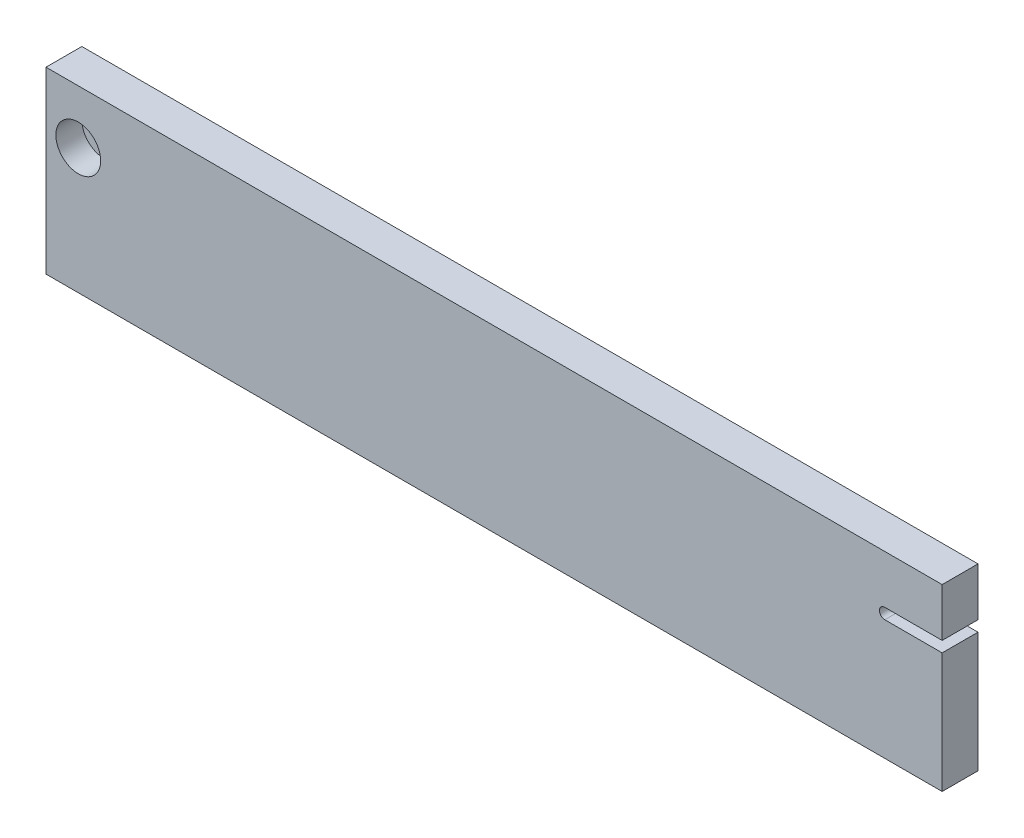
ISO-10303-21;
HEADER;
FILE_DESCRIPTION(('STEP AP214'),'2;1');
FILE_NAME('part.step','',(''),(''),'','','');
FILE_SCHEMA(('AUTOMOTIVE_DESIGN { 1 0 10303 214 1 1 1 1 }'));
ENDSEC;
DATA;
#1=APPLICATION_CONTEXT('core data for automotive mechanical design processes');
#2=APPLICATION_PROTOCOL_DEFINITION('international standard','automotive_design',2000,#1);
#3=PRODUCT_CONTEXT('',#1,'mechanical');
#4=PRODUCT('Part','Part','',(#3));
#5=PRODUCT_RELATED_PRODUCT_CATEGORY('part','',(#4));
#6=PRODUCT_DEFINITION_FORMATION('','',#4);
#7=PRODUCT_DEFINITION_CONTEXT('part definition',#1,'design');
#8=PRODUCT_DEFINITION('design','',#6,#7);
#9=PRODUCT_DEFINITION_SHAPE('','',#8);
#10=(LENGTH_UNIT() NAMED_UNIT(*) SI_UNIT(.MILLI.,.METRE.));
#11=(NAMED_UNIT(*) PLANE_ANGLE_UNIT() SI_UNIT($,.RADIAN.));
#12=(NAMED_UNIT(*) SI_UNIT($,.STERADIAN.) SOLID_ANGLE_UNIT());
#13=UNCERTAINTY_MEASURE_WITH_UNIT(LENGTH_MEASURE(1.E-05),#10,'distance_accuracy_value','');
#14=(GEOMETRIC_REPRESENTATION_CONTEXT(3) GLOBAL_UNCERTAINTY_ASSIGNED_CONTEXT((#13)) GLOBAL_UNIT_ASSIGNED_CONTEXT((#10,
#11,#12)) REPRESENTATION_CONTEXT('',''));
#15=CARTESIAN_POINT('',(0.,0.,0.));
#16=DIRECTION('',(0.,0.,1.));
#17=DIRECTION('',(1.,0.,0.));
#18=AXIS2_PLACEMENT_3D('',#15,#16,#17);
#19=CARTESIAN_POINT('',(18.,70.,0.));
#20=DIRECTION('',(0.,0.,1.));
#21=DIRECTION('',(1.,0.,0.));
#22=AXIS2_PLACEMENT_3D('',#19,#20,#21);
#23=CYLINDRICAL_SURFACE('',#22,3.);
#24=CARTESIAN_POINT('',(18.,70.,0.));
#25=DIRECTION('',(0.,0.,1.));
#26=DIRECTION('',(1.,0.,0.));
#27=AXIS2_PLACEMENT_3D('',#24,#25,#26);
#28=CIRCLE('',#27,3.);
#29=CARTESIAN_POINT('',(21.,70.,0.));
#30=VERTEX_POINT('',#29);
#31=EDGE_CURVE('E148',#30,#30,#28,.T.);
#32=ORIENTED_EDGE('',*,*,#31,.F.);
#33=EDGE_LOOP('',(#32));
#34=FACE_BOUND('',#33,.T.);
#35=CARTESIAN_POINT('',(18.,70.,2.9));
#36=DIRECTION('',(0.,0.,1.));
#37=DIRECTION('',(1.,0.,0.));
#38=AXIS2_PLACEMENT_3D('',#35,#36,#37);
#39=CIRCLE('',#38,3.);
#40=CARTESIAN_POINT('',(21.,70.,2.9));
#41=VERTEX_POINT('',#40);
#42=EDGE_CURVE('E47',#41,#41,#39,.F.);
#43=ORIENTED_EDGE('',*,*,#42,.F.);
#44=EDGE_LOOP('',(#43));
#45=FACE_BOUND('',#44,.T.);
#46=ADVANCED_FACE('F43',(#34,#45),#23,.F.);
#47=CARTESIAN_POINT('',(500.,0.,20.));
#48=DIRECTION('',(-1.,0.,0.));
#49=DIRECTION('',(0.,0.,1.));
#50=AXIS2_PLACEMENT_3D('',#47,#48,#49);
#51=PLANE('',#50);
#52=DIRECTION('',(0.,1.,0.));
#53=VECTOR('',#52,1.);
#54=CARTESIAN_POINT('',(500.,0.,20.));
#55=LINE('',#54,#53);
#56=CARTESIAN_POINT('',(500.,73.,20.));
#57=VERTEX_POINT('',#56);
#58=CARTESIAN_POINT('',(500.,100.,20.));
#59=VERTEX_POINT('',#58);
#60=EDGE_CURVE('E162',#57,#59,#55,.T.);
#61=ORIENTED_EDGE('',*,*,#60,.F.);
#62=DIRECTION('',(0.,0.,-1.));
#63=VECTOR('',#62,1.);
#64=CARTESIAN_POINT('',(500.,73.,20.));
#65=LINE('',#64,#63);
#66=CARTESIAN_POINT('',(500.,73.,0.));
#67=VERTEX_POINT('',#66);
#68=EDGE_CURVE('E155',#57,#67,#65,.T.);
#69=ORIENTED_EDGE('',*,*,#68,.T.);
#70=DIRECTION('',(0.,1.,0.));
#71=VECTOR('',#70,1.);
#72=CARTESIAN_POINT('',(500.,0.,0.));
#73=LINE('',#72,#71);
#74=CARTESIAN_POINT('',(500.,100.,0.));
#75=VERTEX_POINT('',#74);
#76=EDGE_CURVE('E172',#67,#75,#73,.T.);
#77=ORIENTED_EDGE('',*,*,#76,.T.);
#78=DIRECTION('',(0.,0.,-1.));
#79=VECTOR('',#78,1.);
#80=CARTESIAN_POINT('',(500.,100.,20.));
#81=LINE('',#80,#79);
#82=EDGE_CURVE('E177',#59,#75,#81,.T.);
#83=ORIENTED_EDGE('',*,*,#82,.F.);
#84=EDGE_LOOP('',(#61,#69,#77,#83));
#85=FACE_BOUND('',#84,.T.);
#86=ADVANCED_FACE('F196',(#85),#51,.F.);
#87=CARTESIAN_POINT('',(0.,0.,20.));
#88=DIRECTION('',(1.,0.,0.));
#89=DIRECTION('',(0.,0.,-1.));
#90=AXIS2_PLACEMENT_3D('',#87,#88,#89);
#91=PLANE('',#90);
#92=DIRECTION('',(0.,-1.,0.));
#93=VECTOR('',#92,1.);
#94=CARTESIAN_POINT('',(0.,0.,0.));
#95=LINE('',#94,#93);
#96=CARTESIAN_POINT('',(0.,100.,0.));
#97=VERTEX_POINT('',#96);
#98=CARTESIAN_POINT('',(0.,0.,0.));
#99=VERTEX_POINT('',#98);
#100=EDGE_CURVE('E158',#97,#99,#95,.T.);
#101=ORIENTED_EDGE('',*,*,#100,.T.);
#102=DIRECTION('',(0.,0.,-1.));
#103=VECTOR('',#102,1.);
#104=CARTESIAN_POINT('',(0.,0.,20.));
#105=LINE('',#104,#103);
#106=CARTESIAN_POINT('',(0.,0.,20.));
#107=VERTEX_POINT('',#106);
#108=EDGE_CURVE('E52',#107,#99,#105,.T.);
#109=ORIENTED_EDGE('',*,*,#108,.F.);
#110=DIRECTION('',(0.,-1.,0.));
#111=VECTOR('',#110,1.);
#112=CARTESIAN_POINT('',(0.,0.,20.));
#113=LINE('',#112,#111);
#114=CARTESIAN_POINT('',(0.,100.,20.));
#115=VERTEX_POINT('',#114);
#116=EDGE_CURVE('E159',#115,#107,#113,.T.);
#117=ORIENTED_EDGE('',*,*,#116,.F.);
#118=DIRECTION('',(0.,0.,-1.));
#119=VECTOR('',#118,1.);
#120=CARTESIAN_POINT('',(0.,100.,20.));
#121=LINE('',#120,#119);
#122=EDGE_CURVE('E167',#115,#97,#121,.T.);
#123=ORIENTED_EDGE('',*,*,#122,.T.);
#124=EDGE_LOOP('',(#101,#109,#117,#123));
#125=FACE_BOUND('',#124,.T.);
#126=ADVANCED_FACE('F45',(#125),#91,.F.);
#127=CARTESIAN_POINT('',(0.,0.,20.));
#128=DIRECTION('',(0.,1.,0.));
#129=DIRECTION('',(0.,0.,1.));
#130=AXIS2_PLACEMENT_3D('',#127,#128,#129);
#131=PLANE('',#130);
#132=DIRECTION('',(1.,0.,0.));
#133=VECTOR('',#132,1.);
#134=CARTESIAN_POINT('',(0.,0.,0.));
#135=LINE('',#134,#133);
#136=CARTESIAN_POINT('',(500.,0.,0.));
#137=VERTEX_POINT('',#136);
#138=EDGE_CURVE('E170',#99,#137,#135,.T.);
#139=ORIENTED_EDGE('',*,*,#138,.T.);
#140=DIRECTION('',(0.,0.,-1.));
#141=VECTOR('',#140,1.);
#142=CARTESIAN_POINT('',(500.,0.,20.));
#143=LINE('',#142,#141);
#144=CARTESIAN_POINT('',(500.,0.,20.));
#145=VERTEX_POINT('',#144);
#146=EDGE_CURVE('E179',#145,#137,#143,.T.);
#147=ORIENTED_EDGE('',*,*,#146,.F.);
#148=DIRECTION('',(1.,0.,0.));
#149=VECTOR('',#148,1.);
#150=CARTESIAN_POINT('',(0.,0.,20.));
#151=LINE('',#150,#149);
#152=EDGE_CURVE('E97',#107,#145,#151,.T.);
#153=ORIENTED_EDGE('',*,*,#152,.F.);
#154=ORIENTED_EDGE('',*,*,#108,.T.);
#155=EDGE_LOOP('',(#139,#147,#153,#154));
#156=FACE_BOUND('',#155,.T.);
#157=ADVANCED_FACE('F183',(#156),#131,.F.);
#158=CARTESIAN_POINT('',(500.,67.,0.));
#159=VERTEX_POINT('',#158);
#160=EDGE_CURVE('E173',#137,#159,#73,.T.);
#161=ORIENTED_EDGE('',*,*,#160,.T.);
#162=DIRECTION('',(0.,0.,1.));
#163=VECTOR('',#162,1.);
#164=CARTESIAN_POINT('',(500.,67.,20.));
#165=LINE('',#164,#163);
#166=CARTESIAN_POINT('',(500.,67.,20.));
#167=VERTEX_POINT('',#166);
#168=EDGE_CURVE('E59',#159,#167,#165,.T.);
#169=ORIENTED_EDGE('',*,*,#168,.T.);
#170=EDGE_CURVE('E163',#145,#167,#55,.T.);
#171=ORIENTED_EDGE('',*,*,#170,.F.);
#172=ORIENTED_EDGE('',*,*,#146,.T.);
#173=EDGE_LOOP('',(#161,#169,#171,#172));
#174=FACE_BOUND('',#173,.T.);
#175=ADVANCED_FACE('F188',(#174),#51,.F.);
#176=CARTESIAN_POINT('',(0.,100.,20.));
#177=DIRECTION('',(0.,-1.,0.));
#178=DIRECTION('',(0.,0.,-1.));
#179=AXIS2_PLACEMENT_3D('',#176,#177,#178);
#180=PLANE('',#179);
#181=DIRECTION('',(-1.,0.,0.));
#182=VECTOR('',#181,1.);
#183=CARTESIAN_POINT('',(0.,100.,0.));
#184=LINE('',#183,#182);
#185=EDGE_CURVE('E89',#75,#97,#184,.T.);
#186=ORIENTED_EDGE('',*,*,#185,.T.);
#187=ORIENTED_EDGE('',*,*,#122,.F.);
#188=DIRECTION('',(-1.,0.,0.));
#189=VECTOR('',#188,1.);
#190=CARTESIAN_POINT('',(0.,100.,20.));
#191=LINE('',#190,#189);
#192=EDGE_CURVE('E68',#59,#115,#191,.T.);
#193=ORIENTED_EDGE('',*,*,#192,.F.);
#194=ORIENTED_EDGE('',*,*,#82,.T.);
#195=EDGE_LOOP('',(#186,#187,#193,#194));
#196=FACE_BOUND('',#195,.T.);
#197=ADVANCED_FACE('F197',(#196),#180,.F.);
#198=CARTESIAN_POINT('',(0.,0.,20.));
#199=DIRECTION('',(0.,0.,-1.));
#200=DIRECTION('',(-1.,0.,0.));
#201=AXIS2_PLACEMENT_3D('',#198,#199,#200);
#202=PLANE('',#201);
#203=CARTESIAN_POINT('',(18.,70.,20.));
#204=DIRECTION('',(0.,0.,1.));
#205=DIRECTION('',(1.,0.,0.));
#206=AXIS2_PLACEMENT_3D('',#203,#204,#205);
#207=CIRCLE('',#206,12.5);
#208=CARTESIAN_POINT('',(30.5,70.,20.));
#209=VERTEX_POINT('',#208);
#210=EDGE_CURVE('E144',#209,#209,#207,.T.);
#211=ORIENTED_EDGE('',*,*,#210,.F.);
#212=EDGE_LOOP('',(#211));
#213=FACE_BOUND('',#212,.T.);
#214=CARTESIAN_POINT('',(468.,70.,20.));
#215=DIRECTION('',(0.,0.,1.));
#216=DIRECTION('',(1.,0.,0.));
#217=AXIS2_PLACEMENT_3D('',#214,#215,#216);
#218=CIRCLE('',#217,3.);
#219=CARTESIAN_POINT('',(468.,73.,20.));
#220=VERTEX_POINT('',#219);
#221=CARTESIAN_POINT('',(468.,67.,20.));
#222=VERTEX_POINT('',#221);
#223=EDGE_CURVE('E126',#220,#222,#218,.T.);
#224=ORIENTED_EDGE('',*,*,#223,.F.);
#225=DIRECTION('',(-1.,0.,0.));
#226=VECTOR('',#225,1.);
#227=CARTESIAN_POINT('',(468.,73.,20.));
#228=LINE('',#227,#226);
#229=EDGE_CURVE('E139',#57,#220,#228,.T.);
#230=ORIENTED_EDGE('',*,*,#229,.F.);
#231=ORIENTED_EDGE('',*,*,#60,.T.);
#232=ORIENTED_EDGE('',*,*,#192,.T.);
#233=ORIENTED_EDGE('',*,*,#116,.T.);
#234=ORIENTED_EDGE('',*,*,#152,.T.);
#235=ORIENTED_EDGE('',*,*,#170,.T.);
#236=DIRECTION('',(1.,0.,0.));
#237=VECTOR('',#236,1.);
#238=CARTESIAN_POINT('',(468.,67.,20.));
#239=LINE('',#238,#237);
#240=EDGE_CURVE('E141',#222,#167,#239,.T.);
#241=ORIENTED_EDGE('',*,*,#240,.F.);
#242=EDGE_LOOP('',(#224,#230,#231,#232,#233,#234,#235,#241));
#243=FACE_BOUND('',#242,.T.);
#244=ADVANCED_FACE('F190',(#213,#243),#202,.F.);
#245=CARTESIAN_POINT('',(0.,0.,0.));
#246=DIRECTION('',(0.,0.,-1.));
#247=DIRECTION('',(-1.,0.,0.));
#248=AXIS2_PLACEMENT_3D('',#245,#246,#247);
#249=PLANE('',#248);
#250=CARTESIAN_POINT('',(18.,61.5,0.));
#251=DIRECTION('',(0.,0.,1.));
#252=DIRECTION('',(1.,0.,0.));
#253=AXIS2_PLACEMENT_3D('',#250,#251,#252);
#254=CIRCLE('',#253,1.5);
#255=CARTESIAN_POINT('',(19.5,61.5,0.));
#256=VERTEX_POINT('',#255);
#257=EDGE_CURVE('E230',#256,#256,#254,.T.);
#258=ORIENTED_EDGE('',*,*,#257,.T.);
#259=EDGE_LOOP('',(#258));
#260=FACE_BOUND('',#259,.T.);
#261=CARTESIAN_POINT('',(18.,78.5,0.));
#262=DIRECTION('',(0.,0.,1.));
#263=DIRECTION('',(1.,0.,0.));
#264=AXIS2_PLACEMENT_3D('',#261,#262,#263);
#265=CIRCLE('',#264,1.5);
#266=CARTESIAN_POINT('',(19.5,78.5,0.));
#267=VERTEX_POINT('',#266);
#268=EDGE_CURVE('E233',#267,#267,#265,.T.);
#269=ORIENTED_EDGE('',*,*,#268,.T.);
#270=EDGE_LOOP('',(#269));
#271=FACE_BOUND('',#270,.T.);
#272=DIRECTION('',(1.,0.,0.));
#273=VECTOR('',#272,1.);
#274=CARTESIAN_POINT('',(0.,73.,0.));
#275=LINE('',#274,#273);
#276=CARTESIAN_POINT('',(468.,73.,0.));
#277=VERTEX_POINT('',#276);
#278=EDGE_CURVE('E11',#277,#67,#275,.T.);
#279=ORIENTED_EDGE('',*,*,#278,.F.);
#280=CARTESIAN_POINT('',(468.,70.,0.));
#281=DIRECTION('',(0.,0.,1.));
#282=DIRECTION('',(1.,0.,0.));
#283=AXIS2_PLACEMENT_3D('',#280,#281,#282);
#284=CIRCLE('',#283,3.);
#285=CARTESIAN_POINT('',(468.,67.,0.));
#286=VERTEX_POINT('',#285);
#287=EDGE_CURVE('E123',#277,#286,#284,.T.);
#288=ORIENTED_EDGE('',*,*,#287,.T.);
#289=DIRECTION('',(1.,0.,0.));
#290=VECTOR('',#289,1.);
#291=CARTESIAN_POINT('',(468.,67.,0.));
#292=LINE('',#291,#290);
#293=EDGE_CURVE('E129',#286,#159,#292,.T.);
#294=ORIENTED_EDGE('',*,*,#293,.T.);
#295=ORIENTED_EDGE('',*,*,#160,.F.);
#296=ORIENTED_EDGE('',*,*,#138,.F.);
#297=ORIENTED_EDGE('',*,*,#100,.F.);
#298=ORIENTED_EDGE('',*,*,#185,.F.);
#299=ORIENTED_EDGE('',*,*,#76,.F.);
#300=EDGE_LOOP('',(#279,#288,#294,#295,#296,#297,#298,#299));
#301=FACE_BOUND('',#300,.T.);
#302=ORIENTED_EDGE('',*,*,#31,.T.);
#303=EDGE_LOOP('',(#302));
#304=FACE_BOUND('',#303,.T.);
#305=ADVANCED_FACE('F136',(#260,#271,#301,#304),#249,.T.);
#306=CARTESIAN_POINT('',(468.,73.,0.));
#307=DIRECTION('',(0.,1.,0.));
#308=DIRECTION('',(0.,0.,1.));
#309=AXIS2_PLACEMENT_3D('',#306,#307,#308);
#310=PLANE('',#309);
#311=ORIENTED_EDGE('',*,*,#229,.T.);
#312=DIRECTION('',(0.,0.,1.));
#313=VECTOR('',#312,1.);
#314=CARTESIAN_POINT('',(468.,73.,0.));
#315=LINE('',#314,#313);
#316=EDGE_CURVE('E128',#277,#220,#315,.T.);
#317=ORIENTED_EDGE('',*,*,#316,.F.);
#318=ORIENTED_EDGE('',*,*,#278,.T.);
#319=ORIENTED_EDGE('',*,*,#68,.F.);
#320=EDGE_LOOP('',(#311,#317,#318,#319));
#321=FACE_BOUND('',#320,.T.);
#322=ADVANCED_FACE('F221',(#321),#310,.F.);
#323=CARTESIAN_POINT('',(468.,67.,0.));
#324=DIRECTION('',(0.,-1.,0.));
#325=DIRECTION('',(0.,0.,-1.));
#326=AXIS2_PLACEMENT_3D('',#323,#324,#325);
#327=PLANE('',#326);
#328=ORIENTED_EDGE('',*,*,#293,.F.);
#329=DIRECTION('',(0.,0.,1.));
#330=VECTOR('',#329,1.);
#331=CARTESIAN_POINT('',(468.,67.,0.));
#332=LINE('',#331,#330);
#333=EDGE_CURVE('E119',#286,#222,#332,.T.);
#334=ORIENTED_EDGE('',*,*,#333,.T.);
#335=ORIENTED_EDGE('',*,*,#240,.T.);
#336=ORIENTED_EDGE('',*,*,#168,.F.);
#337=EDGE_LOOP('',(#328,#334,#335,#336));
#338=FACE_BOUND('',#337,.T.);
#339=ADVANCED_FACE('F131',(#338),#327,.F.);
#340=CARTESIAN_POINT('',(468.,70.,0.));
#341=DIRECTION('',(0.,0.,1.));
#342=DIRECTION('',(1.,0.,0.));
#343=AXIS2_PLACEMENT_3D('',#340,#341,#342);
#344=CYLINDRICAL_SURFACE('',#343,3.);
#345=ORIENTED_EDGE('',*,*,#223,.T.);
#346=ORIENTED_EDGE('',*,*,#333,.F.);
#347=ORIENTED_EDGE('',*,*,#287,.F.);
#348=ORIENTED_EDGE('',*,*,#316,.T.);
#349=EDGE_LOOP('',(#345,#346,#347,#348));
#350=FACE_BOUND('',#349,.T.);
#351=ADVANCED_FACE('F120',(#350),#344,.F.);
#352=CARTESIAN_POINT('',(18.,70.,5.5));
#353=DIRECTION('',(0.,0.,1.));
#354=DIRECTION('',(1.,0.,0.));
#355=AXIS2_PLACEMENT_3D('',#352,#353,#354);
#356=PLANE('',#355);
#357=CARTESIAN_POINT('',(18.,61.5,5.5));
#358=DIRECTION('',(0.,0.,1.));
#359=DIRECTION('',(1.,0.,0.));
#360=AXIS2_PLACEMENT_3D('',#357,#358,#359);
#361=CIRCLE('',#360,1.5);
#362=CARTESIAN_POINT('',(19.5,61.5,5.5));
#363=VERTEX_POINT('',#362);
#364=EDGE_CURVE('E235',#363,#363,#361,.T.);
#365=ORIENTED_EDGE('',*,*,#364,.F.);
#366=EDGE_LOOP('',(#365));
#367=FACE_BOUND('',#366,.T.);
#368=CARTESIAN_POINT('',(18.,78.5,5.5));
#369=DIRECTION('',(0.,0.,1.));
#370=DIRECTION('',(1.,0.,0.));
#371=AXIS2_PLACEMENT_3D('',#368,#369,#370);
#372=CIRCLE('',#371,1.5);
#373=CARTESIAN_POINT('',(19.5,78.5,5.5));
#374=VERTEX_POINT('',#373);
#375=EDGE_CURVE('E236',#374,#374,#372,.T.);
#376=ORIENTED_EDGE('',*,*,#375,.F.);
#377=EDGE_LOOP('',(#376));
#378=FACE_BOUND('',#377,.T.);
#379=CARTESIAN_POINT('',(18.,70.,5.5));
#380=DIRECTION('',(0.,0.,1.));
#381=DIRECTION('',(1.,0.,0.));
#382=AXIS2_PLACEMENT_3D('',#379,#380,#381);
#383=CIRCLE('',#382,3.5);
#384=CARTESIAN_POINT('',(21.5,70.,5.5));
#385=VERTEX_POINT('',#384);
#386=EDGE_CURVE('E247',#385,#385,#383,.T.);
#387=ORIENTED_EDGE('',*,*,#386,.F.);
#388=EDGE_LOOP('',(#387));
#389=FACE_BOUND('',#388,.T.);
#390=CARTESIAN_POINT('',(18.,70.,5.5));
#391=DIRECTION('',(0.,0.,1.));
#392=DIRECTION('',(1.,0.,0.));
#393=AXIS2_PLACEMENT_3D('',#390,#391,#392);
#394=CIRCLE('',#393,12.5);
#395=CARTESIAN_POINT('',(30.5,70.,5.5));
#396=VERTEX_POINT('',#395);
#397=EDGE_CURVE('E153',#396,#396,#394,.T.);
#398=ORIENTED_EDGE('',*,*,#397,.T.);
#399=EDGE_LOOP('',(#398));
#400=FACE_BOUND('',#399,.T.);
#401=ADVANCED_FACE('F269',(#367,#378,#389,#400),#356,.T.);
#402=CARTESIAN_POINT('',(18.,70.,5.5));
#403=DIRECTION('',(0.,0.,1.));
#404=DIRECTION('',(1.,0.,0.));
#405=AXIS2_PLACEMENT_3D('',#402,#403,#404);
#406=CYLINDRICAL_SURFACE('',#405,12.5);
#407=CARTESIAN_POINT('',(30.5,70.,5.5));
#408=CARTESIAN_POINT('',(30.5,70.,5.65104166666667));
#409=CARTESIAN_POINT('',(30.5,70.,5.80208333333333));
#410=CARTESIAN_POINT('',(30.5,70.,6.10416666666667));
#411=CARTESIAN_POINT('',(30.5,70.,6.25520833333333));
#412=CARTESIAN_POINT('',(30.5,70.,6.55729166666667));
#413=CARTESIAN_POINT('',(30.5,70.,6.70833333333333));
#414=CARTESIAN_POINT('',(30.5,70.,7.01041666666667));
#415=CARTESIAN_POINT('',(30.5,70.,7.16145833333333));
#416=CARTESIAN_POINT('',(30.5,70.,7.46354166666667));
#417=CARTESIAN_POINT('',(30.5,70.,7.61458333333333));
#418=CARTESIAN_POINT('',(30.5,70.,7.91666666666667));
#419=CARTESIAN_POINT('',(30.5,70.,8.06770833333333));
#420=CARTESIAN_POINT('',(30.5,70.,8.36979166666667));
#421=CARTESIAN_POINT('',(30.5,70.,8.52083333333333));
#422=CARTESIAN_POINT('',(30.5,70.,8.82291666666667));
#423=CARTESIAN_POINT('',(30.5,70.,8.97395833333333));
#424=CARTESIAN_POINT('',(30.5,70.,9.27604166666667));
#425=CARTESIAN_POINT('',(30.5,70.,9.42708333333333));
#426=CARTESIAN_POINT('',(30.5,70.,9.72916666666667));
#427=CARTESIAN_POINT('',(30.5,70.,9.88020833333333));
#428=CARTESIAN_POINT('',(30.5,70.,10.1822916666667));
#429=CARTESIAN_POINT('',(30.5,70.,10.3333333333333));
#430=CARTESIAN_POINT('',(30.5,70.,10.6354166666667));
#431=CARTESIAN_POINT('',(30.5,70.,10.7864583333333));
#432=CARTESIAN_POINT('',(30.5,70.,11.0885416666667));
#433=CARTESIAN_POINT('',(30.5,70.,11.2395833333333));
#434=CARTESIAN_POINT('',(30.5,70.,11.5416666666667));
#435=CARTESIAN_POINT('',(30.5,70.,11.6927083333333));
#436=CARTESIAN_POINT('',(30.5,70.,11.9947916666667));
#437=CARTESIAN_POINT('',(30.5,70.,12.1458333333333));
#438=CARTESIAN_POINT('',(30.5,70.,12.4479166666667));
#439=CARTESIAN_POINT('',(30.5,70.,12.5989583333333));
#440=CARTESIAN_POINT('',(30.5,70.,12.9010416666667));
#441=CARTESIAN_POINT('',(30.5,70.,13.0520833333333));
#442=CARTESIAN_POINT('',(30.5,70.,13.3541666666667));
#443=CARTESIAN_POINT('',(30.5,70.,13.5052083333333));
#444=CARTESIAN_POINT('',(30.5,70.,13.8072916666667));
#445=CARTESIAN_POINT('',(30.5,70.,13.9583333333333));
#446=CARTESIAN_POINT('',(30.5,70.,14.2604166666667));
#447=CARTESIAN_POINT('',(30.5,70.,14.4114583333333));
#448=CARTESIAN_POINT('',(30.5,70.,14.7135416666667));
#449=CARTESIAN_POINT('',(30.5,70.,14.8645833333333));
#450=CARTESIAN_POINT('',(30.5,70.,15.1666666666667));
#451=CARTESIAN_POINT('',(30.5,70.,15.3177083333333));
#452=CARTESIAN_POINT('',(30.5,70.,15.6197916666667));
#453=CARTESIAN_POINT('',(30.5,70.,15.7708333333333));
#454=CARTESIAN_POINT('',(30.5,70.,16.0729166666667));
#455=CARTESIAN_POINT('',(30.5,70.,16.2239583333333));
#456=CARTESIAN_POINT('',(30.5,70.,16.5260416666667));
#457=CARTESIAN_POINT('',(30.5,70.,16.6770833333333));
#458=CARTESIAN_POINT('',(30.5,70.,16.9791666666667));
#459=CARTESIAN_POINT('',(30.5,70.,17.1302083333333));
#460=CARTESIAN_POINT('',(30.5,70.,17.4322916666667));
#461=CARTESIAN_POINT('',(30.5,70.,17.5833333333333));
#462=CARTESIAN_POINT('',(30.5,70.,17.8854166666667));
#463=CARTESIAN_POINT('',(30.5,70.,18.0364583333333));
#464=CARTESIAN_POINT('',(30.5,70.,18.3385416666667));
#465=CARTESIAN_POINT('',(30.5,70.,18.4895833333333));
#466=CARTESIAN_POINT('',(30.5,70.,18.7916666666667));
#467=CARTESIAN_POINT('',(30.5,70.,18.9427083333333));
#468=CARTESIAN_POINT('',(30.5,70.,19.2447916666667));
#469=CARTESIAN_POINT('',(30.5,70.,19.3958333333333));
#470=CARTESIAN_POINT('',(30.5,70.,19.6979166666667));
#471=CARTESIAN_POINT('',(30.5,70.,19.8489583333333));
#472=CARTESIAN_POINT('',(30.5,70.,20.));
#473=B_SPLINE_CURVE_WITH_KNOTS('',3,(#407,#408,#409,#410,#411,#412,#413,#414,#415,#416,#417,
#418,#419,#420,#421,#422,#423,#424,#425,#426,#427,#428,#429,#430,#431,#432,#433,#434,#435,#436,
#437,#438,#439,#440,#441,#442,#443,#444,#445,#446,#447,#448,#449,#450,#451,#452,#453,#454,#455,
#456,#457,#458,#459,#460,#461,#462,#463,#464,#465,#466,#467,#468,#469,#470,#471,#472),
.UNSPECIFIED.,.F.,.F.,(4,2,2,2,2,2,2,2,2,2,2,2,2,2,2,2,2,2,2,2,2,2,2,2,2,2,2,2,2,2,2,2,4),(0.,
0.453125,0.90625,1.359375,1.8125,2.265625,2.71875,3.171875,3.625,4.078125,4.53125,4.984375,
5.4375,5.890625,6.34375,6.796875,7.25,7.703125,8.15625,8.609375,9.0625,9.515625,9.96875,
10.421875,10.875,11.328125,11.78125,12.234375,12.6875,13.140625,13.59375,14.046875,14.5),.UNSPECIFIED.);
#474=EDGE_CURVE('BSEAM260',#396,#209,#473,.T.);
#475=ORIENTED_EDGE('',*,*,#397,.F.);
#476=ORIENTED_EDGE('',*,*,#210,.T.);
#477=ORIENTED_EDGE('',*,*,#474,.T.);
#478=ORIENTED_EDGE('',*,*,#474,.F.);
#479=EDGE_LOOP('',(#475,#477,#476,#478));
#480=FACE_BOUND('',#479,.T.);
#481=ADVANCED_FACE('F260',(#480),#406,.F.);
#482=CARTESIAN_POINT('',(18.,70.,2.9));
#483=DIRECTION('',(0.,0.,1.));
#484=DIRECTION('',(1.,0.,0.));
#485=AXIS2_PLACEMENT_3D('',#482,#483,#484);
#486=PLANE('',#485);
#487=CARTESIAN_POINT('',(18.,70.,2.9));
#488=DIRECTION('',(0.,0.,1.));
#489=DIRECTION('',(1.,0.,0.));
#490=AXIS2_PLACEMENT_3D('',#487,#488,#489);
#491=CIRCLE('',#490,3.5);
#492=CARTESIAN_POINT('',(21.5,70.,2.9));
#493=VERTEX_POINT('',#492);
#494=EDGE_CURVE('E244',#493,#493,#491,.T.);
#495=ORIENTED_EDGE('',*,*,#494,.T.);
#496=EDGE_LOOP('',(#495));
#497=FACE_BOUND('',#496,.T.);
#498=ORIENTED_EDGE('',*,*,#42,.T.);
#499=EDGE_LOOP('',(#498));
#500=FACE_BOUND('',#499,.T.);
#501=ADVANCED_FACE('F258',(#497,#500),#486,.T.);
#502=CARTESIAN_POINT('',(18.,70.,2.9));
#503=DIRECTION('',(0.,0.,1.));
#504=DIRECTION('',(1.,0.,0.));
#505=AXIS2_PLACEMENT_3D('',#502,#503,#504);
#506=CYLINDRICAL_SURFACE('',#505,3.5);
#507=ORIENTED_EDGE('',*,*,#494,.F.);
#508=EDGE_LOOP('',(#507));
#509=FACE_BOUND('',#508,.T.);
#510=ORIENTED_EDGE('',*,*,#386,.T.);
#511=EDGE_LOOP('',(#510));
#512=FACE_BOUND('',#511,.T.);
#513=ADVANCED_FACE('F259',(#509,#512),#506,.F.);
#514=CARTESIAN_POINT('',(18.,78.5,0.));
#515=DIRECTION('',(0.,0.,1.));
#516=DIRECTION('',(1.,0.,0.));
#517=AXIS2_PLACEMENT_3D('',#514,#515,#516);
#518=CYLINDRICAL_SURFACE('',#517,1.5);
#519=ORIENTED_EDGE('',*,*,#268,.F.);
#520=EDGE_LOOP('',(#519));
#521=FACE_BOUND('',#520,.T.);
#522=ORIENTED_EDGE('',*,*,#375,.T.);
#523=EDGE_LOOP('',(#522));
#524=FACE_BOUND('',#523,.T.);
#525=ADVANCED_FACE('F266',(#521,#524),#518,.F.);
#526=CARTESIAN_POINT('',(18.,61.5,0.));
#527=DIRECTION('',(0.,0.,1.));
#528=DIRECTION('',(1.,0.,0.));
#529=AXIS2_PLACEMENT_3D('',#526,#527,#528);
#530=CYLINDRICAL_SURFACE('',#529,1.5);
#531=ORIENTED_EDGE('',*,*,#257,.F.);
#532=EDGE_LOOP('',(#531));
#533=FACE_BOUND('',#532,.T.);
#534=ORIENTED_EDGE('',*,*,#364,.T.);
#535=EDGE_LOOP('',(#534));
#536=FACE_BOUND('',#535,.T.);
#537=ADVANCED_FACE('F327',(#533,#536),#530,.F.);
#538=CLOSED_SHELL('',(#46,#86,#126,#157,#175,#197,#244,#305,#322,#339,#351,#401,#481,#501,#513,
#525,#537));
#539=MANIFOLD_SOLID_BREP('B2',#538);
#540=ADVANCED_BREP_SHAPE_REPRESENTATION('',(#18,#539),#14);
#541=SHAPE_DEFINITION_REPRESENTATION(#9,#540);
ENDSEC;
END-ISO-10303-21;
